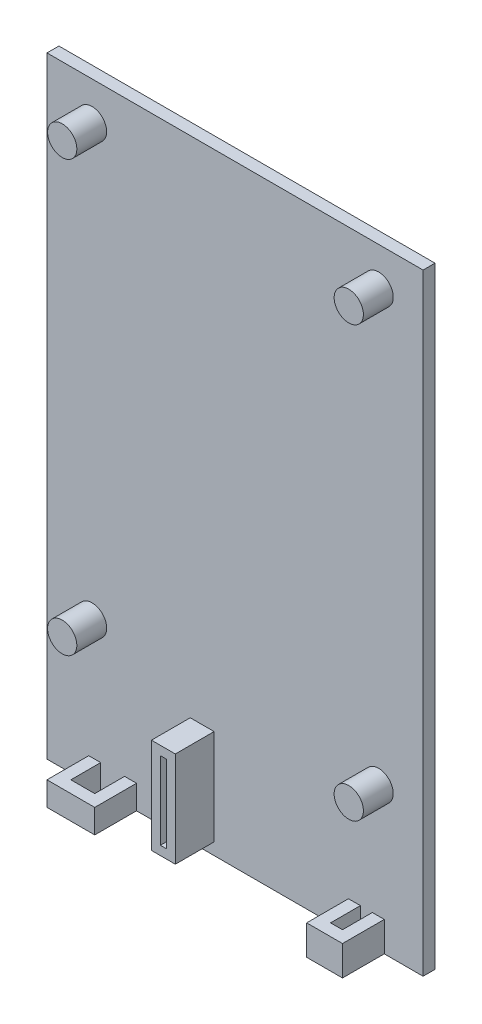
ISO-10303-21;
HEADER;
FILE_DESCRIPTION(('STEP AP214'),'2;1');
FILE_NAME('part.step','',(''),(''),'','','');
FILE_SCHEMA(('AUTOMOTIVE_DESIGN { 1 0 10303 214 1 1 1 1 }'));
ENDSEC;
DATA;
#1=APPLICATION_CONTEXT('core data for automotive mechanical design processes');
#2=APPLICATION_PROTOCOL_DEFINITION('international standard','automotive_design',2000,#1);
#3=PRODUCT_CONTEXT('',#1,'mechanical');
#4=PRODUCT('Part','Part','',(#3));
#5=PRODUCT_RELATED_PRODUCT_CATEGORY('part','',(#4));
#6=PRODUCT_DEFINITION_FORMATION('','',#4);
#7=PRODUCT_DEFINITION_CONTEXT('part definition',#1,'design');
#8=PRODUCT_DEFINITION('design','',#6,#7);
#9=PRODUCT_DEFINITION_SHAPE('','',#8);
#10=(LENGTH_UNIT() NAMED_UNIT(*) SI_UNIT(.MILLI.,.METRE.));
#11=(NAMED_UNIT(*) PLANE_ANGLE_UNIT() SI_UNIT($,.RADIAN.));
#12=(NAMED_UNIT(*) SI_UNIT($,.STERADIAN.) SOLID_ANGLE_UNIT());
#13=UNCERTAINTY_MEASURE_WITH_UNIT(LENGTH_MEASURE(1.E-05),#10,'distance_accuracy_value','');
#14=(GEOMETRIC_REPRESENTATION_CONTEXT(3) GLOBAL_UNCERTAINTY_ASSIGNED_CONTEXT((#13)) GLOBAL_UNIT_ASSIGNED_CONTEXT((#10,
#11,#12)) REPRESENTATION_CONTEXT('',''));
#15=CARTESIAN_POINT('',(0.,0.,0.));
#16=DIRECTION('',(0.,0.,1.));
#17=DIRECTION('',(1.,0.,0.));
#18=AXIS2_PLACEMENT_3D('',#15,#16,#17);
#19=CARTESIAN_POINT('',(0.,0.,2.));
#20=DIRECTION('',(0.,0.,1.));
#21=DIRECTION('',(1.,0.,0.));
#22=AXIS2_PLACEMENT_3D('',#19,#20,#21);
#23=PLANE('',#22);
#24=CARTESIAN_POINT('',(7.55000000000003,-6.45,2.));
#25=DIRECTION('',(0.,0.,1.));
#26=DIRECTION('',(1.,0.,0.));
#27=AXIS2_PLACEMENT_3D('',#24,#25,#26);
#28=CIRCLE('',#27,2.45);
#29=CARTESIAN_POINT('',(10.,-6.45,2.));
#30=VERTEX_POINT('',#29);
#31=EDGE_CURVE('E421',#30,#30,#28,.T.);
#32=ORIENTED_EDGE('',*,*,#31,.F.);
#33=EDGE_LOOP('',(#32));
#34=FACE_BOUND('',#33,.T.);
#35=CARTESIAN_POINT('',(7.55000000000003,-78.45,2.));
#36=DIRECTION('',(0.,0.,1.));
#37=DIRECTION('',(1.,0.,0.));
#38=AXIS2_PLACEMENT_3D('',#35,#36,#37);
#39=CIRCLE('',#38,2.44999999999999);
#40=CARTESIAN_POINT('',(10.,-78.45,2.));
#41=VERTEX_POINT('',#40);
#42=EDGE_CURVE('E415',#41,#41,#39,.T.);
#43=ORIENTED_EDGE('',*,*,#42,.F.);
#44=EDGE_LOOP('',(#43));
#45=FACE_BOUND('',#44,.T.);
#46=CARTESIAN_POINT('',(55.55,-78.45,2.));
#47=DIRECTION('',(0.,0.,1.));
#48=DIRECTION('',(1.,0.,0.));
#49=AXIS2_PLACEMENT_3D('',#46,#47,#48);
#50=CIRCLE('',#49,2.44999999999998);
#51=CARTESIAN_POINT('',(58.,-78.45,2.));
#52=VERTEX_POINT('',#51);
#53=EDGE_CURVE('E409',#52,#52,#50,.T.);
#54=ORIENTED_EDGE('',*,*,#53,.F.);
#55=EDGE_LOOP('',(#54));
#56=FACE_BOUND('',#55,.T.);
#57=CARTESIAN_POINT('',(55.55,-6.45,2.));
#58=DIRECTION('',(0.,0.,1.));
#59=DIRECTION('',(1.,0.,0.));
#60=AXIS2_PLACEMENT_3D('',#57,#58,#59);
#61=CIRCLE('',#60,2.45);
#62=CARTESIAN_POINT('',(58.,-6.45,2.));
#63=VERTEX_POINT('',#62);
#64=EDGE_CURVE('E405',#63,#63,#61,.T.);
#65=ORIENTED_EDGE('',*,*,#64,.F.);
#66=EDGE_LOOP('',(#65));
#67=FACE_BOUND('',#66,.T.);
#68=DIRECTION('',(-1.,0.,0.));
#69=VECTOR('',#68,1.);
#70=CARTESIAN_POINT('',(7.,-98.45,2.));
#71=LINE('',#70,#69);
#72=CARTESIAN_POINT('',(9.,-98.45,2.));
#73=VERTEX_POINT('',#72);
#74=CARTESIAN_POINT('',(7.,-98.45,2.));
#75=VERTEX_POINT('',#74);
#76=EDGE_CURVE('E382',#73,#75,#71,.T.);
#77=ORIENTED_EDGE('',*,*,#76,.F.);
#78=DIRECTION('',(0.,-1.,0.));
#79=VECTOR('',#78,1.);
#80=CARTESIAN_POINT('',(9.,-97.45,2.));
#81=LINE('',#80,#79);
#82=CARTESIAN_POINT('',(9.,-102.45,2.));
#83=VERTEX_POINT('',#82);
#84=EDGE_CURVE('E298',#73,#83,#81,.T.);
#85=ORIENTED_EDGE('',*,*,#84,.T.);
#86=DIRECTION('',(1.,0.,0.));
#87=VECTOR('',#86,1.);
#88=CARTESIAN_POINT('',(9.,-102.45,2.));
#89=LINE('',#88,#87);
#90=CARTESIAN_POINT('',(13.,-102.45,2.));
#91=VERTEX_POINT('',#90);
#92=EDGE_CURVE('E288',#83,#91,#89,.T.);
#93=ORIENTED_EDGE('',*,*,#92,.T.);
#94=DIRECTION('',(0.,-1.,0.));
#95=VECTOR('',#94,1.);
#96=CARTESIAN_POINT('',(13.,-97.45,2.));
#97=LINE('',#96,#95);
#98=CARTESIAN_POINT('',(13.,-98.45,2.));
#99=VERTEX_POINT('',#98);
#100=EDGE_CURVE('E304',#99,#91,#97,.T.);
#101=ORIENTED_EDGE('',*,*,#100,.F.);
#102=CARTESIAN_POINT('',(15.,-98.45,2.));
#103=VERTEX_POINT('',#102);
#104=EDGE_CURVE('E370',#103,#99,#71,.T.);
#105=ORIENTED_EDGE('',*,*,#104,.F.);
#106=DIRECTION('',(0.,1.,0.));
#107=VECTOR('',#106,1.);
#108=CARTESIAN_POINT('',(15.,-102.45,2.));
#109=LINE('',#108,#107);
#110=CARTESIAN_POINT('',(15.,-102.45,2.));
#111=VERTEX_POINT('',#110);
#112=EDGE_CURVE('E379',#111,#103,#109,.T.);
#113=ORIENTED_EDGE('',*,*,#112,.F.);
#114=DIRECTION('',(1.,0.,0.));
#115=VECTOR('',#114,1.);
#116=CARTESIAN_POINT('',(0.,-102.45,2.));
#117=LINE('',#116,#115);
#118=CARTESIAN_POINT('',(50.5,-102.45,2.));
#119=VERTEX_POINT('',#118);
#120=EDGE_CURVE('E400',#111,#119,#117,.T.);
#121=ORIENTED_EDGE('',*,*,#120,.T.);
#122=DIRECTION('',(0.,-1.,0.));
#123=VECTOR('',#122,1.);
#124=CARTESIAN_POINT('',(50.5,-102.45,2.));
#125=LINE('',#124,#123);
#126=CARTESIAN_POINT('',(50.5,-97.45,2.));
#127=VERTEX_POINT('',#126);
#128=EDGE_CURVE('E301',#127,#119,#125,.T.);
#129=ORIENTED_EDGE('',*,*,#128,.F.);
#130=DIRECTION('',(-1.,0.,0.));
#131=VECTOR('',#130,1.);
#132=CARTESIAN_POINT('',(50.5,-97.45,2.));
#133=LINE('',#132,#131);
#134=CARTESIAN_POINT('',(52.5,-97.45,2.));
#135=VERTEX_POINT('',#134);
#136=EDGE_CURVE('E351',#135,#127,#133,.T.);
#137=ORIENTED_EDGE('',*,*,#136,.F.);
#138=DIRECTION('',(0.,-1.,0.));
#139=VECTOR('',#138,1.);
#140=CARTESIAN_POINT('',(52.5,-97.45,2.));
#141=LINE('',#140,#139);
#142=CARTESIAN_POINT('',(52.5,-102.45,2.));
#143=VERTEX_POINT('',#142);
#144=EDGE_CURVE('E318',#135,#143,#141,.T.);
#145=ORIENTED_EDGE('',*,*,#144,.T.);
#146=DIRECTION('',(1.,0.,0.));
#147=VECTOR('',#146,1.);
#148=CARTESIAN_POINT('',(52.5,-102.45,2.));
#149=LINE('',#148,#147);
#150=CARTESIAN_POINT('',(54.5,-102.45,2.));
#151=VERTEX_POINT('',#150);
#152=EDGE_CURVE('E320',#143,#151,#149,.T.);
#153=ORIENTED_EDGE('',*,*,#152,.T.);
#154=DIRECTION('',(0.,-1.,0.));
#155=VECTOR('',#154,1.);
#156=CARTESIAN_POINT('',(54.5,-97.45,2.));
#157=LINE('',#156,#155);
#158=CARTESIAN_POINT('',(54.5,-97.45,2.));
#159=VERTEX_POINT('',#158);
#160=EDGE_CURVE('E331',#159,#151,#157,.T.);
#161=ORIENTED_EDGE('',*,*,#160,.F.);
#162=CARTESIAN_POINT('',(56.5,-97.45,2.));
#163=VERTEX_POINT('',#162);
#164=EDGE_CURVE('E339',#163,#159,#133,.T.);
#165=ORIENTED_EDGE('',*,*,#164,.F.);
#166=DIRECTION('',(0.,1.,0.));
#167=VECTOR('',#166,1.);
#168=CARTESIAN_POINT('',(56.5,-102.45,2.));
#169=LINE('',#168,#167);
#170=CARTESIAN_POINT('',(56.5,-102.45,2.));
#171=VERTEX_POINT('',#170);
#172=EDGE_CURVE('E348',#171,#163,#169,.T.);
#173=ORIENTED_EDGE('',*,*,#172,.F.);
#174=CARTESIAN_POINT('',(63.,-102.45,2.));
#175=VERTEX_POINT('',#174);
#176=EDGE_CURVE('E395',#171,#175,#117,.T.);
#177=ORIENTED_EDGE('',*,*,#176,.T.);
#178=DIRECTION('',(0.,-1.,0.));
#179=VECTOR('',#178,1.);
#180=CARTESIAN_POINT('',(63.,-54.,2.));
#181=LINE('',#180,#179);
#182=CARTESIAN_POINT('',(63.,0.,2.));
#183=VERTEX_POINT('',#182);
#184=EDGE_CURVE('E402',#183,#175,#181,.T.);
#185=ORIENTED_EDGE('',*,*,#184,.F.);
#186=DIRECTION('',(-1.,0.,0.));
#187=VECTOR('',#186,1.);
#188=CARTESIAN_POINT('',(63.,0.,2.));
#189=LINE('',#188,#187);
#190=CARTESIAN_POINT('',(0.,0.,2.));
#191=VERTEX_POINT('',#190);
#192=EDGE_CURVE('E399',#183,#191,#189,.T.);
#193=ORIENTED_EDGE('',*,*,#192,.T.);
#194=DIRECTION('',(0.,-1.,0.));
#195=VECTOR('',#194,1.);
#196=CARTESIAN_POINT('',(0.,0.,2.));
#197=LINE('',#196,#195);
#198=CARTESIAN_POINT('',(0.,-102.45,2.));
#199=VERTEX_POINT('',#198);
#200=EDGE_CURVE('E393',#191,#199,#197,.T.);
#201=ORIENTED_EDGE('',*,*,#200,.T.);
#202=CARTESIAN_POINT('',(7.,-102.45,2.));
#203=VERTEX_POINT('',#202);
#204=EDGE_CURVE('E396',#199,#203,#117,.T.);
#205=ORIENTED_EDGE('',*,*,#204,.T.);
#206=DIRECTION('',(0.,-1.,0.));
#207=VECTOR('',#206,1.);
#208=CARTESIAN_POINT('',(7.,-102.45,2.));
#209=LINE('',#208,#207);
#210=EDGE_CURVE('E365',#75,#203,#209,.T.);
#211=ORIENTED_EDGE('',*,*,#210,.F.);
#212=EDGE_LOOP('',(#77,#85,#93,#101,#105,#113,#121,#129,#137,#145,#153,#161,#165,#173,#177,#185,
#193,#201,#205,#211));
#213=FACE_BOUND('',#212,.T.);
#214=DIRECTION('',(1.,0.,0.));
#215=VECTOR('',#214,1.);
#216=CARTESIAN_POINT('',(24.,-100.45,2.));
#217=LINE('',#216,#215);
#218=CARTESIAN_POINT('',(24.,-100.45,2.));
#219=VERTEX_POINT('',#218);
#220=CARTESIAN_POINT('',(28.,-100.45,2.));
#221=VERTEX_POINT('',#220);
#222=EDGE_CURVE('E272',#219,#221,#217,.T.);
#223=ORIENTED_EDGE('',*,*,#222,.F.);
#224=DIRECTION('',(0.,-1.,0.));
#225=VECTOR('',#224,1.);
#226=CARTESIAN_POINT('',(24.,-84.45,2.));
#227=LINE('',#226,#225);
#228=CARTESIAN_POINT('',(24.,-84.45,2.));
#229=VERTEX_POINT('',#228);
#230=EDGE_CURVE('E237',#229,#219,#227,.T.);
#231=ORIENTED_EDGE('',*,*,#230,.F.);
#232=DIRECTION('',(-1.,0.,0.));
#233=VECTOR('',#232,1.);
#234=CARTESIAN_POINT('',(24.,-84.45,2.));
#235=LINE('',#234,#233);
#236=CARTESIAN_POINT('',(28.,-84.45,2.));
#237=VERTEX_POINT('',#236);
#238=EDGE_CURVE('E263',#237,#229,#235,.T.);
#239=ORIENTED_EDGE('',*,*,#238,.F.);
#240=DIRECTION('',(0.,1.,0.));
#241=VECTOR('',#240,1.);
#242=CARTESIAN_POINT('',(28.,-84.45,2.));
#243=LINE('',#242,#241);
#244=EDGE_CURVE('E274',#221,#237,#243,.T.);
#245=ORIENTED_EDGE('',*,*,#244,.F.);
#246=EDGE_LOOP('',(#223,#231,#239,#245));
#247=FACE_BOUND('',#246,.T.);
#248=ADVANCED_FACE('F33',(#34,#45,#56,#67,#213,#247),#23,.T.);
#249=CARTESIAN_POINT('',(0.,0.,2.));
#250=DIRECTION('',(1.,0.,0.));
#251=DIRECTION('',(0.,1.,0.));
#252=AXIS2_PLACEMENT_3D('',#249,#250,#251);
#253=PLANE('',#252);
#254=ORIENTED_EDGE('',*,*,#200,.F.);
#255=DIRECTION('',(0.,0.,-1.));
#256=VECTOR('',#255,1.);
#257=CARTESIAN_POINT('',(0.,0.,2.));
#258=LINE('',#257,#256);
#259=CARTESIAN_POINT('',(0.,0.,0.));
#260=VERTEX_POINT('',#259);
#261=EDGE_CURVE('E441',#191,#260,#258,.T.);
#262=ORIENTED_EDGE('',*,*,#261,.T.);
#263=DIRECTION('',(0.,-1.,0.));
#264=VECTOR('',#263,1.);
#265=CARTESIAN_POINT('',(0.,0.,0.));
#266=LINE('',#265,#264);
#267=CARTESIAN_POINT('',(0.,-102.45,0.));
#268=VERTEX_POINT('',#267);
#269=EDGE_CURVE('E427',#260,#268,#266,.T.);
#270=ORIENTED_EDGE('',*,*,#269,.T.);
#271=DIRECTION('',(0.,0.,-1.));
#272=VECTOR('',#271,1.);
#273=CARTESIAN_POINT('',(0.,-102.45,2.));
#274=LINE('',#273,#272);
#275=EDGE_CURVE('E447',#199,#268,#274,.T.);
#276=ORIENTED_EDGE('',*,*,#275,.F.);
#277=EDGE_LOOP('',(#254,#262,#270,#276));
#278=FACE_BOUND('',#277,.T.);
#279=ADVANCED_FACE('F35',(#278),#253,.F.);
#280=CARTESIAN_POINT('',(50.,-102.45,2.));
#281=DIRECTION('',(0.,1.,0.));
#282=DIRECTION('',(0.,0.,1.));
#283=AXIS2_PLACEMENT_3D('',#280,#281,#282);
#284=PLANE('',#283);
#285=ORIENTED_EDGE('',*,*,#92,.F.);
#286=DIRECTION('',(0.,0.,-1.));
#287=VECTOR('',#286,1.);
#288=CARTESIAN_POINT('',(9.,-102.45,7.));
#289=LINE('',#288,#287);
#290=CARTESIAN_POINT('',(9.,-102.45,7.));
#291=VERTEX_POINT('',#290);
#292=EDGE_CURVE('E286',#291,#83,#289,.T.);
#293=ORIENTED_EDGE('',*,*,#292,.F.);
#294=DIRECTION('',(-1.,0.,0.));
#295=VECTOR('',#294,1.);
#296=CARTESIAN_POINT('',(9.,-102.45,7.));
#297=LINE('',#296,#295);
#298=CARTESIAN_POINT('',(13.,-102.45,7.));
#299=VERTEX_POINT('',#298);
#300=EDGE_CURVE('E295',#299,#291,#297,.T.);
#301=ORIENTED_EDGE('',*,*,#300,.F.);
#302=DIRECTION('',(0.,0.,1.));
#303=VECTOR('',#302,1.);
#304=CARTESIAN_POINT('',(13.,-102.45,7.));
#305=LINE('',#304,#303);
#306=EDGE_CURVE('E292',#91,#299,#305,.T.);
#307=ORIENTED_EDGE('',*,*,#306,.F.);
#308=EDGE_LOOP('',(#285,#293,#301,#307));
#309=FACE_BOUND('',#308,.T.);
#310=ORIENTED_EDGE('',*,*,#152,.F.);
#311=DIRECTION('',(0.,0.,-1.));
#312=VECTOR('',#311,1.);
#313=CARTESIAN_POINT('',(52.5,-102.45,7.));
#314=LINE('',#313,#312);
#315=CARTESIAN_POINT('',(52.5,-102.45,7.));
#316=VERTEX_POINT('',#315);
#317=EDGE_CURVE('E285',#316,#143,#314,.T.);
#318=ORIENTED_EDGE('',*,*,#317,.F.);
#319=DIRECTION('',(-1.,0.,0.));
#320=VECTOR('',#319,1.);
#321=CARTESIAN_POINT('',(52.5,-102.45,7.));
#322=LINE('',#321,#320);
#323=CARTESIAN_POINT('',(54.5,-102.45,7.));
#324=VERTEX_POINT('',#323);
#325=EDGE_CURVE('E312',#324,#316,#322,.T.);
#326=ORIENTED_EDGE('',*,*,#325,.F.);
#327=DIRECTION('',(0.,0.,1.));
#328=VECTOR('',#327,1.);
#329=CARTESIAN_POINT('',(54.5,-102.45,7.));
#330=LINE('',#329,#328);
#331=EDGE_CURVE('E323',#151,#324,#330,.T.);
#332=ORIENTED_EDGE('',*,*,#331,.F.);
#333=EDGE_LOOP('',(#310,#318,#326,#332));
#334=FACE_BOUND('',#333,.T.);
#335=ORIENTED_EDGE('',*,*,#204,.F.);
#336=ORIENTED_EDGE('',*,*,#275,.T.);
#337=DIRECTION('',(1.,0.,0.));
#338=VECTOR('',#337,1.);
#339=CARTESIAN_POINT('',(50.,-102.45,0.));
#340=LINE('',#339,#338);
#341=CARTESIAN_POINT('',(63.,-102.45,0.));
#342=VERTEX_POINT('',#341);
#343=EDGE_CURVE('E432',#268,#342,#340,.T.);
#344=ORIENTED_EDGE('',*,*,#343,.T.);
#345=DIRECTION('',(0.,0.,-1.));
#346=VECTOR('',#345,1.);
#347=CARTESIAN_POINT('',(63.,-102.45,2.));
#348=LINE('',#347,#346);
#349=EDGE_CURVE('E445',#175,#342,#348,.T.);
#350=ORIENTED_EDGE('',*,*,#349,.F.);
#351=ORIENTED_EDGE('',*,*,#176,.F.);
#352=DIRECTION('',(0.,0.,-1.));
#353=VECTOR('',#352,1.);
#354=CARTESIAN_POINT('',(56.5,-102.45,9.));
#355=LINE('',#354,#353);
#356=CARTESIAN_POINT('',(56.5,-102.45,9.));
#357=VERTEX_POINT('',#356);
#358=EDGE_CURVE('E359',#357,#171,#355,.T.);
#359=ORIENTED_EDGE('',*,*,#358,.F.);
#360=DIRECTION('',(1.,0.,0.));
#361=VECTOR('',#360,1.);
#362=CARTESIAN_POINT('',(50.5,-102.45,9.));
#363=LINE('',#362,#361);
#364=CARTESIAN_POINT('',(50.5,-102.45,9.));
#365=VERTEX_POINT('',#364);
#366=EDGE_CURVE('E338',#365,#357,#363,.T.);
#367=ORIENTED_EDGE('',*,*,#366,.F.);
#368=DIRECTION('',(0.,0.,-1.));
#369=VECTOR('',#368,1.);
#370=CARTESIAN_POINT('',(50.5,-102.45,9.));
#371=LINE('',#370,#369);
#372=EDGE_CURVE('E362',#365,#119,#371,.T.);
#373=ORIENTED_EDGE('',*,*,#372,.T.);
#374=ORIENTED_EDGE('',*,*,#120,.F.);
#375=DIRECTION('',(0.,0.,-1.));
#376=VECTOR('',#375,1.);
#377=CARTESIAN_POINT('',(15.,-102.45,9.));
#378=LINE('',#377,#376);
#379=CARTESIAN_POINT('',(15.,-102.45,9.));
#380=VERTEX_POINT('',#379);
#381=EDGE_CURVE('E389',#380,#111,#378,.T.);
#382=ORIENTED_EDGE('',*,*,#381,.F.);
#383=DIRECTION('',(1.,0.,0.));
#384=VECTOR('',#383,1.);
#385=CARTESIAN_POINT('',(7.,-102.45,9.));
#386=LINE('',#385,#384);
#387=CARTESIAN_POINT('',(7.,-102.45,9.));
#388=VERTEX_POINT('',#387);
#389=EDGE_CURVE('E369',#388,#380,#386,.T.);
#390=ORIENTED_EDGE('',*,*,#389,.F.);
#391=DIRECTION('',(0.,0.,-1.));
#392=VECTOR('',#391,1.);
#393=CARTESIAN_POINT('',(7.,-102.45,9.));
#394=LINE('',#393,#392);
#395=EDGE_CURVE('E391',#388,#203,#394,.T.);
#396=ORIENTED_EDGE('',*,*,#395,.T.);
#397=EDGE_LOOP('',(#335,#336,#344,#350,#351,#359,#367,#373,#374,#382,#390,#396));
#398=FACE_BOUND('',#397,.T.);
#399=ADVANCED_FACE('F467',(#309,#334,#398),#284,.F.);
#400=CARTESIAN_POINT('',(63.,0.,2.));
#401=DIRECTION('',(-1.,0.,0.));
#402=DIRECTION('',(0.,-1.,0.));
#403=AXIS2_PLACEMENT_3D('',#400,#401,#402);
#404=PLANE('',#403);
#405=ORIENTED_EDGE('',*,*,#184,.T.);
#406=ORIENTED_EDGE('',*,*,#349,.T.);
#407=DIRECTION('',(0.,1.,0.));
#408=VECTOR('',#407,1.);
#409=CARTESIAN_POINT('',(63.,0.,0.));
#410=LINE('',#409,#408);
#411=CARTESIAN_POINT('',(63.,0.,0.));
#412=VERTEX_POINT('',#411);
#413=EDGE_CURVE('E435',#342,#412,#410,.T.);
#414=ORIENTED_EDGE('',*,*,#413,.T.);
#415=DIRECTION('',(0.,0.,-1.));
#416=VECTOR('',#415,1.);
#417=CARTESIAN_POINT('',(63.,0.,2.));
#418=LINE('',#417,#416);
#419=EDGE_CURVE('E443',#183,#412,#418,.T.);
#420=ORIENTED_EDGE('',*,*,#419,.F.);
#421=EDGE_LOOP('',(#405,#406,#414,#420));
#422=FACE_BOUND('',#421,.T.);
#423=ADVANCED_FACE('F500',(#422),#404,.F.);
#424=CARTESIAN_POINT('',(0.,0.,2.));
#425=DIRECTION('',(0.,-1.,0.));
#426=DIRECTION('',(0.,0.,-1.));
#427=AXIS2_PLACEMENT_3D('',#424,#425,#426);
#428=PLANE('',#427);
#429=ORIENTED_EDGE('',*,*,#192,.F.);
#430=ORIENTED_EDGE('',*,*,#419,.T.);
#431=DIRECTION('',(-1.,0.,0.));
#432=VECTOR('',#431,1.);
#433=CARTESIAN_POINT('',(0.,0.,0.));
#434=LINE('',#433,#432);
#435=EDGE_CURVE('E438',#412,#260,#434,.T.);
#436=ORIENTED_EDGE('',*,*,#435,.T.);
#437=ORIENTED_EDGE('',*,*,#261,.F.);
#438=EDGE_LOOP('',(#429,#430,#436,#437));
#439=FACE_BOUND('',#438,.T.);
#440=ADVANCED_FACE('F510',(#439),#428,.F.);
#441=CARTESIAN_POINT('',(0.,0.,0.));
#442=DIRECTION('',(0.,0.,1.));
#443=DIRECTION('',(1.,0.,0.));
#444=AXIS2_PLACEMENT_3D('',#441,#442,#443);
#445=PLANE('',#444);
#446=ORIENTED_EDGE('',*,*,#343,.F.);
#447=ORIENTED_EDGE('',*,*,#269,.F.);
#448=ORIENTED_EDGE('',*,*,#435,.F.);
#449=ORIENTED_EDGE('',*,*,#413,.F.);
#450=EDGE_LOOP('',(#446,#447,#448,#449));
#451=FACE_BOUND('',#450,.T.);
#452=ADVANCED_FACE('F507',(#451),#445,.F.);
#453=CARTESIAN_POINT('',(7.55000000000003,-6.45,7.));
#454=DIRECTION('',(0.,0.,-1.));
#455=DIRECTION('',(-1.,0.,0.));
#456=AXIS2_PLACEMENT_3D('',#453,#454,#455);
#457=CYLINDRICAL_SURFACE('',#456,2.45);
#458=CARTESIAN_POINT('',(7.55000000000003,-6.45,7.));
#459=DIRECTION('',(0.,0.,1.));
#460=DIRECTION('',(1.,0.,0.));
#461=AXIS2_PLACEMENT_3D('',#458,#459,#460);
#462=CIRCLE('',#461,2.45);
#463=CARTESIAN_POINT('',(10.,-6.45,7.));
#464=VERTEX_POINT('',#463);
#465=EDGE_CURVE('E424',#464,#464,#462,.T.);
#466=ORIENTED_EDGE('',*,*,#465,.F.);
#467=EDGE_LOOP('',(#466));
#468=FACE_BOUND('',#467,.T.);
#469=ORIENTED_EDGE('',*,*,#31,.T.);
#470=EDGE_LOOP('',(#469));
#471=FACE_BOUND('',#470,.T.);
#472=ADVANCED_FACE('F632',(#468,#471),#457,.T.);
#473=CARTESIAN_POINT('',(7.55000000000003,-6.45,7.));
#474=DIRECTION('',(0.,0.,1.));
#475=DIRECTION('',(1.,0.,0.));
#476=AXIS2_PLACEMENT_3D('',#473,#474,#475);
#477=PLANE('',#476);
#478=ORIENTED_EDGE('',*,*,#465,.T.);
#479=EDGE_LOOP('',(#478));
#480=FACE_BOUND('',#479,.T.);
#481=ADVANCED_FACE('F629',(#480),#477,.T.);
#482=CARTESIAN_POINT('',(7.55000000000003,-78.45,7.));
#483=DIRECTION('',(0.,0.,-1.));
#484=DIRECTION('',(-1.,0.,0.));
#485=AXIS2_PLACEMENT_3D('',#482,#483,#484);
#486=CYLINDRICAL_SURFACE('',#485,2.44999999999999);
#487=CARTESIAN_POINT('',(7.55000000000003,-78.45,7.));
#488=DIRECTION('',(0.,0.,1.));
#489=DIRECTION('',(1.,0.,0.));
#490=AXIS2_PLACEMENT_3D('',#487,#488,#489);
#491=CIRCLE('',#490,2.44999999999999);
#492=CARTESIAN_POINT('',(10.,-78.45,7.));
#493=VERTEX_POINT('',#492);
#494=EDGE_CURVE('E418',#493,#493,#491,.T.);
#495=ORIENTED_EDGE('',*,*,#494,.F.);
#496=EDGE_LOOP('',(#495));
#497=FACE_BOUND('',#496,.T.);
#498=ORIENTED_EDGE('',*,*,#42,.T.);
#499=EDGE_LOOP('',(#498));
#500=FACE_BOUND('',#499,.T.);
#501=ADVANCED_FACE('F625',(#497,#500),#486,.T.);
#502=CARTESIAN_POINT('',(7.55000000000003,-78.45,7.));
#503=DIRECTION('',(0.,0.,1.));
#504=DIRECTION('',(1.,0.,0.));
#505=AXIS2_PLACEMENT_3D('',#502,#503,#504);
#506=PLANE('',#505);
#507=ORIENTED_EDGE('',*,*,#494,.T.);
#508=EDGE_LOOP('',(#507));
#509=FACE_BOUND('',#508,.T.);
#510=ADVANCED_FACE('F621',(#509),#506,.T.);
#511=CARTESIAN_POINT('',(55.55,-78.45,7.));
#512=DIRECTION('',(0.,0.,-1.));
#513=DIRECTION('',(-1.,0.,0.));
#514=AXIS2_PLACEMENT_3D('',#511,#512,#513);
#515=CYLINDRICAL_SURFACE('',#514,2.44999999999998);
#516=CARTESIAN_POINT('',(55.55,-78.45,7.));
#517=DIRECTION('',(0.,0.,1.));
#518=DIRECTION('',(1.,0.,0.));
#519=AXIS2_PLACEMENT_3D('',#516,#517,#518);
#520=CIRCLE('',#519,2.44999999999998);
#521=CARTESIAN_POINT('',(58.,-78.45,7.));
#522=VERTEX_POINT('',#521);
#523=EDGE_CURVE('E412',#522,#522,#520,.T.);
#524=ORIENTED_EDGE('',*,*,#523,.F.);
#525=EDGE_LOOP('',(#524));
#526=FACE_BOUND('',#525,.T.);
#527=ORIENTED_EDGE('',*,*,#53,.T.);
#528=EDGE_LOOP('',(#527));
#529=FACE_BOUND('',#528,.T.);
#530=ADVANCED_FACE('F617',(#526,#529),#515,.T.);
#531=CARTESIAN_POINT('',(55.55,-78.45,7.));
#532=DIRECTION('',(0.,0.,1.));
#533=DIRECTION('',(1.,0.,0.));
#534=AXIS2_PLACEMENT_3D('',#531,#532,#533);
#535=PLANE('',#534);
#536=ORIENTED_EDGE('',*,*,#523,.T.);
#537=EDGE_LOOP('',(#536));
#538=FACE_BOUND('',#537,.T.);
#539=ADVANCED_FACE('F613',(#538),#535,.T.);
#540=CARTESIAN_POINT('',(55.55,-6.45,7.));
#541=DIRECTION('',(0.,0.,-1.));
#542=DIRECTION('',(-1.,0.,0.));
#543=AXIS2_PLACEMENT_3D('',#540,#541,#542);
#544=CYLINDRICAL_SURFACE('',#543,2.45);
#545=CARTESIAN_POINT('',(55.55,-6.45,7.));
#546=DIRECTION('',(0.,0.,1.));
#547=DIRECTION('',(1.,0.,0.));
#548=AXIS2_PLACEMENT_3D('',#545,#546,#547);
#549=CIRCLE('',#548,2.45);
#550=CARTESIAN_POINT('',(58.,-6.45,7.));
#551=VERTEX_POINT('',#550);
#552=EDGE_CURVE('E406',#551,#551,#549,.T.);
#553=ORIENTED_EDGE('',*,*,#552,.F.);
#554=EDGE_LOOP('',(#553));
#555=FACE_BOUND('',#554,.T.);
#556=ORIENTED_EDGE('',*,*,#64,.T.);
#557=EDGE_LOOP('',(#556));
#558=FACE_BOUND('',#557,.T.);
#559=ADVANCED_FACE('F609',(#555,#558),#544,.T.);
#560=CARTESIAN_POINT('',(55.55,-6.45,7.));
#561=DIRECTION('',(0.,0.,1.));
#562=DIRECTION('',(1.,0.,0.));
#563=AXIS2_PLACEMENT_3D('',#560,#561,#562);
#564=PLANE('',#563);
#565=ORIENTED_EDGE('',*,*,#552,.T.);
#566=EDGE_LOOP('',(#565));
#567=FACE_BOUND('',#566,.T.);
#568=ADVANCED_FACE('F606',(#567),#564,.T.);
#569=CARTESIAN_POINT('',(7.,-102.45,9.));
#570=DIRECTION('',(1.,0.,0.));
#571=DIRECTION('',(0.,0.,-1.));
#572=AXIS2_PLACEMENT_3D('',#569,#570,#571);
#573=PLANE('',#572);
#574=ORIENTED_EDGE('',*,*,#210,.T.);
#575=ORIENTED_EDGE('',*,*,#395,.F.);
#576=DIRECTION('',(0.,-1.,0.));
#577=VECTOR('',#576,1.);
#578=CARTESIAN_POINT('',(7.,-102.45,9.));
#579=LINE('',#578,#577);
#580=CARTESIAN_POINT('',(7.,-98.45,9.));
#581=VERTEX_POINT('',#580);
#582=EDGE_CURVE('E366',#581,#388,#579,.T.);
#583=ORIENTED_EDGE('',*,*,#582,.F.);
#584=DIRECTION('',(0.,0.,-1.));
#585=VECTOR('',#584,1.);
#586=CARTESIAN_POINT('',(7.,-98.45,9.));
#587=LINE('',#586,#585);
#588=EDGE_CURVE('E376',#581,#75,#587,.T.);
#589=ORIENTED_EDGE('',*,*,#588,.T.);
#590=EDGE_LOOP('',(#574,#575,#583,#589));
#591=FACE_BOUND('',#590,.T.);
#592=ADVANCED_FACE('F478',(#591),#573,.F.);
#593=CARTESIAN_POINT('',(15.,-102.45,9.));
#594=DIRECTION('',(-1.,0.,0.));
#595=DIRECTION('',(0.,0.,1.));
#596=AXIS2_PLACEMENT_3D('',#593,#594,#595);
#597=PLANE('',#596);
#598=ORIENTED_EDGE('',*,*,#112,.T.);
#599=DIRECTION('',(0.,0.,-1.));
#600=VECTOR('',#599,1.);
#601=CARTESIAN_POINT('',(15.,-98.45,9.));
#602=LINE('',#601,#600);
#603=CARTESIAN_POINT('',(15.,-98.45,9.));
#604=VERTEX_POINT('',#603);
#605=EDGE_CURVE('E387',#604,#103,#602,.T.);
#606=ORIENTED_EDGE('',*,*,#605,.F.);
#607=DIRECTION('',(0.,1.,0.));
#608=VECTOR('',#607,1.);
#609=CARTESIAN_POINT('',(15.,-102.45,9.));
#610=LINE('',#609,#608);
#611=EDGE_CURVE('E372',#380,#604,#610,.T.);
#612=ORIENTED_EDGE('',*,*,#611,.F.);
#613=ORIENTED_EDGE('',*,*,#381,.T.);
#614=EDGE_LOOP('',(#598,#606,#612,#613));
#615=FACE_BOUND('',#614,.T.);
#616=ADVANCED_FACE('F488',(#615),#597,.F.);
#617=CARTESIAN_POINT('',(7.,-98.45,9.));
#618=DIRECTION('',(0.,-1.,0.));
#619=DIRECTION('',(0.,0.,-1.));
#620=AXIS2_PLACEMENT_3D('',#617,#618,#619);
#621=PLANE('',#620);
#622=DIRECTION('',(-1.,0.,0.));
#623=VECTOR('',#622,1.);
#624=CARTESIAN_POINT('',(7.,-98.45,7.));
#625=LINE('',#624,#623);
#626=CARTESIAN_POINT('',(13.,-98.45,7.));
#627=VERTEX_POINT('',#626);
#628=CARTESIAN_POINT('',(9.,-98.45,7.));
#629=VERTEX_POINT('',#628);
#630=EDGE_CURVE('E41',#627,#629,#625,.T.);
#631=ORIENTED_EDGE('',*,*,#630,.T.);
#632=DIRECTION('',(0.,0.,-1.));
#633=VECTOR('',#632,1.);
#634=CARTESIAN_POINT('',(9.,-98.45,9.));
#635=LINE('',#634,#633);
#636=EDGE_CURVE('E11',#629,#73,#635,.T.);
#637=ORIENTED_EDGE('',*,*,#636,.T.);
#638=ORIENTED_EDGE('',*,*,#76,.T.);
#639=ORIENTED_EDGE('',*,*,#588,.F.);
#640=DIRECTION('',(-1.,0.,0.));
#641=VECTOR('',#640,1.);
#642=CARTESIAN_POINT('',(7.,-98.45,9.));
#643=LINE('',#642,#641);
#644=EDGE_CURVE('E374',#604,#581,#643,.T.);
#645=ORIENTED_EDGE('',*,*,#644,.F.);
#646=ORIENTED_EDGE('',*,*,#605,.T.);
#647=ORIENTED_EDGE('',*,*,#104,.T.);
#648=DIRECTION('',(0.,0.,1.));
#649=VECTOR('',#648,1.);
#650=CARTESIAN_POINT('',(13.,-98.45,9.));
#651=LINE('',#650,#649);
#652=EDGE_CURVE('E449',#99,#627,#651,.T.);
#653=ORIENTED_EDGE('',*,*,#652,.T.);
#654=EDGE_LOOP('',(#631,#637,#638,#639,#645,#646,#647,#653));
#655=FACE_BOUND('',#654,.T.);
#656=ADVANCED_FACE('F453',(#655),#621,.F.);
#657=CARTESIAN_POINT('',(0.,0.,9.));
#658=DIRECTION('',(0.,0.,-1.));
#659=DIRECTION('',(-1.,0.,0.));
#660=AXIS2_PLACEMENT_3D('',#657,#658,#659);
#661=PLANE('',#660);
#662=ORIENTED_EDGE('',*,*,#582,.T.);
#663=ORIENTED_EDGE('',*,*,#389,.T.);
#664=ORIENTED_EDGE('',*,*,#611,.T.);
#665=ORIENTED_EDGE('',*,*,#644,.T.);
#666=EDGE_LOOP('',(#662,#663,#664,#665));
#667=FACE_BOUND('',#666,.T.);
#668=ADVANCED_FACE('F481',(#667),#661,.F.);
#669=CARTESIAN_POINT('',(50.5,-102.45,9.));
#670=DIRECTION('',(1.,0.,0.));
#671=DIRECTION('',(0.,0.,-1.));
#672=AXIS2_PLACEMENT_3D('',#669,#670,#671);
#673=PLANE('',#672);
#674=ORIENTED_EDGE('',*,*,#128,.T.);
#675=ORIENTED_EDGE('',*,*,#372,.F.);
#676=DIRECTION('',(0.,-1.,0.));
#677=VECTOR('',#676,1.);
#678=CARTESIAN_POINT('',(50.5,-102.45,9.));
#679=LINE('',#678,#677);
#680=CARTESIAN_POINT('',(50.5,-97.45,9.));
#681=VERTEX_POINT('',#680);
#682=EDGE_CURVE('E335',#681,#365,#679,.T.);
#683=ORIENTED_EDGE('',*,*,#682,.F.);
#684=DIRECTION('',(0.,0.,-1.));
#685=VECTOR('',#684,1.);
#686=CARTESIAN_POINT('',(50.5,-97.45,9.));
#687=LINE('',#686,#685);
#688=EDGE_CURVE('E345',#681,#127,#687,.T.);
#689=ORIENTED_EDGE('',*,*,#688,.T.);
#690=EDGE_LOOP('',(#674,#675,#683,#689));
#691=FACE_BOUND('',#690,.T.);
#692=ADVANCED_FACE('F593',(#691),#673,.F.);
#693=CARTESIAN_POINT('',(56.5,-102.45,9.));
#694=DIRECTION('',(-1.,0.,0.));
#695=DIRECTION('',(0.,0.,1.));
#696=AXIS2_PLACEMENT_3D('',#693,#694,#695);
#697=PLANE('',#696);
#698=ORIENTED_EDGE('',*,*,#172,.T.);
#699=DIRECTION('',(0.,0.,-1.));
#700=VECTOR('',#699,1.);
#701=CARTESIAN_POINT('',(56.5,-97.45,9.));
#702=LINE('',#701,#700);
#703=CARTESIAN_POINT('',(56.5,-97.45,9.));
#704=VERTEX_POINT('',#703);
#705=EDGE_CURVE('E356',#704,#163,#702,.T.);
#706=ORIENTED_EDGE('',*,*,#705,.F.);
#707=DIRECTION('',(0.,1.,0.));
#708=VECTOR('',#707,1.);
#709=CARTESIAN_POINT('',(56.5,-102.45,9.));
#710=LINE('',#709,#708);
#711=EDGE_CURVE('E341',#357,#704,#710,.T.);
#712=ORIENTED_EDGE('',*,*,#711,.F.);
#713=ORIENTED_EDGE('',*,*,#358,.T.);
#714=EDGE_LOOP('',(#698,#706,#712,#713));
#715=FACE_BOUND('',#714,.T.);
#716=ADVANCED_FACE('F589',(#715),#697,.F.);
#717=CARTESIAN_POINT('',(50.5,-97.45,9.));
#718=DIRECTION('',(0.,-1.,0.));
#719=DIRECTION('',(0.,0.,-1.));
#720=AXIS2_PLACEMENT_3D('',#717,#718,#719);
#721=PLANE('',#720);
#722=DIRECTION('',(-1.,0.,0.));
#723=VECTOR('',#722,1.);
#724=CARTESIAN_POINT('',(52.5,-97.45,7.));
#725=LINE('',#724,#723);
#726=CARTESIAN_POINT('',(54.5,-97.45,7.));
#727=VERTEX_POINT('',#726);
#728=CARTESIAN_POINT('',(52.5,-97.45,7.));
#729=VERTEX_POINT('',#728);
#730=EDGE_CURVE('E315',#727,#729,#725,.T.);
#731=ORIENTED_EDGE('',*,*,#730,.T.);
#732=DIRECTION('',(0.,0.,-1.));
#733=VECTOR('',#732,1.);
#734=CARTESIAN_POINT('',(52.5,-97.45,7.));
#735=LINE('',#734,#733);
#736=EDGE_CURVE('E308',#729,#135,#735,.T.);
#737=ORIENTED_EDGE('',*,*,#736,.T.);
#738=ORIENTED_EDGE('',*,*,#136,.T.);
#739=ORIENTED_EDGE('',*,*,#688,.F.);
#740=DIRECTION('',(-1.,0.,0.));
#741=VECTOR('',#740,1.);
#742=CARTESIAN_POINT('',(50.5,-97.45,9.));
#743=LINE('',#742,#741);
#744=EDGE_CURVE('E343',#704,#681,#743,.T.);
#745=ORIENTED_EDGE('',*,*,#744,.F.);
#746=ORIENTED_EDGE('',*,*,#705,.T.);
#747=ORIENTED_EDGE('',*,*,#164,.T.);
#748=DIRECTION('',(0.,0.,1.));
#749=VECTOR('',#748,1.);
#750=CARTESIAN_POINT('',(54.5,-97.45,7.));
#751=LINE('',#750,#749);
#752=EDGE_CURVE('E311',#159,#727,#751,.T.);
#753=ORIENTED_EDGE('',*,*,#752,.T.);
#754=EDGE_LOOP('',(#731,#737,#738,#739,#745,#746,#747,#753));
#755=FACE_BOUND('',#754,.T.);
#756=ADVANCED_FACE('F585',(#755),#721,.F.);
#757=CARTESIAN_POINT('',(0.,0.,9.));
#758=DIRECTION('',(0.,0.,-1.));
#759=DIRECTION('',(-1.,0.,0.));
#760=AXIS2_PLACEMENT_3D('',#757,#758,#759);
#761=PLANE('',#760);
#762=ORIENTED_EDGE('',*,*,#682,.T.);
#763=ORIENTED_EDGE('',*,*,#366,.T.);
#764=ORIENTED_EDGE('',*,*,#711,.T.);
#765=ORIENTED_EDGE('',*,*,#744,.T.);
#766=EDGE_LOOP('',(#762,#763,#764,#765));
#767=FACE_BOUND('',#766,.T.);
#768=ADVANCED_FACE('F581',(#767),#761,.F.);
#769=CARTESIAN_POINT('',(52.5,-97.45,7.));
#770=DIRECTION('',(-1.,0.,0.));
#771=DIRECTION('',(0.,0.,1.));
#772=AXIS2_PLACEMENT_3D('',#769,#770,#771);
#773=PLANE('',#772);
#774=ORIENTED_EDGE('',*,*,#317,.T.);
#775=ORIENTED_EDGE('',*,*,#144,.F.);
#776=ORIENTED_EDGE('',*,*,#736,.F.);
#777=DIRECTION('',(0.,-1.,0.));
#778=VECTOR('',#777,1.);
#779=CARTESIAN_POINT('',(52.5,-97.45,7.));
#780=LINE('',#779,#778);
#781=EDGE_CURVE('E289',#729,#316,#780,.T.);
#782=ORIENTED_EDGE('',*,*,#781,.T.);
#783=EDGE_LOOP('',(#774,#775,#776,#782));
#784=FACE_BOUND('',#783,.T.);
#785=ADVANCED_FACE('F574',(#784),#773,.F.);
#786=CARTESIAN_POINT('',(52.5,-97.45,7.));
#787=DIRECTION('',(0.,0.,1.));
#788=DIRECTION('',(1.,0.,0.));
#789=AXIS2_PLACEMENT_3D('',#786,#787,#788);
#790=PLANE('',#789);
#791=ORIENTED_EDGE('',*,*,#325,.T.);
#792=ORIENTED_EDGE('',*,*,#781,.F.);
#793=ORIENTED_EDGE('',*,*,#730,.F.);
#794=DIRECTION('',(0.,-1.,0.));
#795=VECTOR('',#794,1.);
#796=CARTESIAN_POINT('',(54.5,-97.45,7.));
#797=LINE('',#796,#795);
#798=EDGE_CURVE('E329',#727,#324,#797,.T.);
#799=ORIENTED_EDGE('',*,*,#798,.T.);
#800=EDGE_LOOP('',(#791,#792,#793,#799));
#801=FACE_BOUND('',#800,.T.);
#802=ADVANCED_FACE('F571',(#801),#790,.F.);
#803=CARTESIAN_POINT('',(54.5,-97.45,7.));
#804=DIRECTION('',(1.,0.,0.));
#805=DIRECTION('',(0.,0.,-1.));
#806=AXIS2_PLACEMENT_3D('',#803,#804,#805);
#807=PLANE('',#806);
#808=ORIENTED_EDGE('',*,*,#331,.T.);
#809=ORIENTED_EDGE('',*,*,#798,.F.);
#810=ORIENTED_EDGE('',*,*,#752,.F.);
#811=ORIENTED_EDGE('',*,*,#160,.T.);
#812=EDGE_LOOP('',(#808,#809,#810,#811));
#813=FACE_BOUND('',#812,.T.);
#814=ADVANCED_FACE('F570',(#813),#807,.F.);
#815=CARTESIAN_POINT('',(9.,-97.45,7.));
#816=DIRECTION('',(-1.,0.,0.));
#817=DIRECTION('',(0.,0.,1.));
#818=AXIS2_PLACEMENT_3D('',#815,#816,#817);
#819=PLANE('',#818);
#820=DIRECTION('',(0.,-1.,0.));
#821=VECTOR('',#820,1.);
#822=CARTESIAN_POINT('',(9.,-97.45,7.));
#823=LINE('',#822,#821);
#824=EDGE_CURVE('E299',#629,#291,#823,.T.);
#825=ORIENTED_EDGE('',*,*,#824,.T.);
#826=ORIENTED_EDGE('',*,*,#292,.T.);
#827=ORIENTED_EDGE('',*,*,#84,.F.);
#828=ORIENTED_EDGE('',*,*,#636,.F.);
#829=EDGE_LOOP('',(#825,#826,#827,#828));
#830=FACE_BOUND('',#829,.T.);
#831=ADVANCED_FACE('F470',(#830),#819,.F.);
#832=CARTESIAN_POINT('',(9.,-97.45,7.));
#833=DIRECTION('',(0.,0.,1.));
#834=DIRECTION('',(1.,0.,0.));
#835=AXIS2_PLACEMENT_3D('',#832,#833,#834);
#836=PLANE('',#835);
#837=DIRECTION('',(0.,-1.,0.));
#838=VECTOR('',#837,1.);
#839=CARTESIAN_POINT('',(13.,-97.45,7.));
#840=LINE('',#839,#838);
#841=EDGE_CURVE('E302',#627,#299,#840,.T.);
#842=ORIENTED_EDGE('',*,*,#841,.T.);
#843=ORIENTED_EDGE('',*,*,#300,.T.);
#844=ORIENTED_EDGE('',*,*,#824,.F.);
#845=ORIENTED_EDGE('',*,*,#630,.F.);
#846=EDGE_LOOP('',(#842,#843,#844,#845));
#847=FACE_BOUND('',#846,.T.);
#848=ADVANCED_FACE('F459',(#847),#836,.F.);
#849=CARTESIAN_POINT('',(13.,-97.45,7.));
#850=DIRECTION('',(1.,0.,0.));
#851=DIRECTION('',(0.,0.,-1.));
#852=AXIS2_PLACEMENT_3D('',#849,#850,#851);
#853=PLANE('',#852);
#854=ORIENTED_EDGE('',*,*,#100,.T.);
#855=ORIENTED_EDGE('',*,*,#306,.T.);
#856=ORIENTED_EDGE('',*,*,#841,.F.);
#857=ORIENTED_EDGE('',*,*,#652,.F.);
#858=EDGE_LOOP('',(#854,#855,#856,#857));
#859=FACE_BOUND('',#858,.T.);
#860=ADVANCED_FACE('F461',(#859),#853,.F.);
#861=CARTESIAN_POINT('',(0.,0.,8.5));
#862=DIRECTION('',(0.,0.,1.));
#863=DIRECTION('',(1.,0.,0.));
#864=AXIS2_PLACEMENT_3D('',#861,#862,#863);
#865=PLANE('',#864);
#866=DIRECTION('',(0.,-1.,0.));
#867=VECTOR('',#866,1.);
#868=CARTESIAN_POINT('',(24.,-84.45,8.5));
#869=LINE('',#868,#867);
#870=CARTESIAN_POINT('',(24.,-84.45,8.5));
#871=VERTEX_POINT('',#870);
#872=CARTESIAN_POINT('',(24.,-100.45,8.5));
#873=VERTEX_POINT('',#872);
#874=EDGE_CURVE('E259',#871,#873,#869,.T.);
#875=ORIENTED_EDGE('',*,*,#874,.T.);
#876=DIRECTION('',(1.,0.,0.));
#877=VECTOR('',#876,1.);
#878=CARTESIAN_POINT('',(24.,-100.45,8.5));
#879=LINE('',#878,#877);
#880=CARTESIAN_POINT('',(28.,-100.45,8.5));
#881=VERTEX_POINT('',#880);
#882=EDGE_CURVE('E262',#873,#881,#879,.T.);
#883=ORIENTED_EDGE('',*,*,#882,.T.);
#884=DIRECTION('',(0.,1.,0.));
#885=VECTOR('',#884,1.);
#886=CARTESIAN_POINT('',(28.,-84.45,8.5));
#887=LINE('',#886,#885);
#888=CARTESIAN_POINT('',(28.,-84.45,8.5));
#889=VERTEX_POINT('',#888);
#890=EDGE_CURVE('E265',#881,#889,#887,.T.);
#891=ORIENTED_EDGE('',*,*,#890,.T.);
#892=DIRECTION('',(-1.,0.,0.));
#893=VECTOR('',#892,1.);
#894=CARTESIAN_POINT('',(24.,-84.45,8.5));
#895=LINE('',#894,#893);
#896=EDGE_CURVE('E267',#889,#871,#895,.T.);
#897=ORIENTED_EDGE('',*,*,#896,.T.);
#898=EDGE_LOOP('',(#875,#883,#891,#897));
#899=FACE_BOUND('',#898,.T.);
#900=DIRECTION('',(1.,0.,0.));
#901=VECTOR('',#900,1.);
#902=CARTESIAN_POINT('',(25.5,-98.95,8.5));
#903=LINE('',#902,#901);
#904=CARTESIAN_POINT('',(25.5,-98.95,8.5));
#905=VERTEX_POINT('',#904);
#906=CARTESIAN_POINT('',(26.5,-98.95,8.5));
#907=VERTEX_POINT('',#906);
#908=EDGE_CURVE('E229',#905,#907,#903,.T.);
#909=ORIENTED_EDGE('',*,*,#908,.F.);
#910=DIRECTION('',(0.,-1.,0.));
#911=VECTOR('',#910,1.);
#912=CARTESIAN_POINT('',(25.5,-85.95,8.5));
#913=LINE('',#912,#911);
#914=CARTESIAN_POINT('',(25.5,-85.95,8.5));
#915=VERTEX_POINT('',#914);
#916=EDGE_CURVE('E220',#915,#905,#913,.T.);
#917=ORIENTED_EDGE('',*,*,#916,.F.);
#918=DIRECTION('',(-1.,0.,0.));
#919=VECTOR('',#918,1.);
#920=CARTESIAN_POINT('',(25.5,-85.95,8.5));
#921=LINE('',#920,#919);
#922=CARTESIAN_POINT('',(26.5,-85.95,8.5));
#923=VERTEX_POINT('',#922);
#924=EDGE_CURVE('E245',#923,#915,#921,.T.);
#925=ORIENTED_EDGE('',*,*,#924,.F.);
#926=DIRECTION('',(0.,1.,0.));
#927=VECTOR('',#926,1.);
#928=CARTESIAN_POINT('',(26.5,-85.95,8.5));
#929=LINE('',#928,#927);
#930=EDGE_CURVE('E243',#907,#923,#929,.T.);
#931=ORIENTED_EDGE('',*,*,#930,.F.);
#932=EDGE_LOOP('',(#909,#917,#925,#931));
#933=FACE_BOUND('',#932,.T.);
#934=ADVANCED_FACE('F241',(#899,#933),#865,.T.);
#935=CARTESIAN_POINT('',(24.,-84.45,8.5));
#936=DIRECTION('',(1.,0.,0.));
#937=DIRECTION('',(0.,1.,0.));
#938=AXIS2_PLACEMENT_3D('',#935,#936,#937);
#939=PLANE('',#938);
#940=ORIENTED_EDGE('',*,*,#230,.T.);
#941=DIRECTION('',(0.,0.,-1.));
#942=VECTOR('',#941,1.);
#943=CARTESIAN_POINT('',(24.,-100.45,8.5));
#944=LINE('',#943,#942);
#945=EDGE_CURVE('E283',#873,#219,#944,.T.);
#946=ORIENTED_EDGE('',*,*,#945,.F.);
#947=ORIENTED_EDGE('',*,*,#874,.F.);
#948=DIRECTION('',(0.,0.,-1.));
#949=VECTOR('',#948,1.);
#950=CARTESIAN_POINT('',(24.,-84.45,8.5));
#951=LINE('',#950,#949);
#952=EDGE_CURVE('E269',#871,#229,#951,.T.);
#953=ORIENTED_EDGE('',*,*,#952,.T.);
#954=EDGE_LOOP('',(#940,#946,#947,#953));
#955=FACE_BOUND('',#954,.T.);
#956=ADVANCED_FACE('F549',(#955),#939,.F.);
#957=CARTESIAN_POINT('',(24.,-100.45,8.5));
#958=DIRECTION('',(0.,1.,0.));
#959=DIRECTION('',(0.,0.,1.));
#960=AXIS2_PLACEMENT_3D('',#957,#958,#959);
#961=PLANE('',#960);
#962=ORIENTED_EDGE('',*,*,#222,.T.);
#963=DIRECTION('',(0.,0.,-1.));
#964=VECTOR('',#963,1.);
#965=CARTESIAN_POINT('',(28.,-100.45,8.5));
#966=LINE('',#965,#964);
#967=EDGE_CURVE('E280',#881,#221,#966,.T.);
#968=ORIENTED_EDGE('',*,*,#967,.F.);
#969=ORIENTED_EDGE('',*,*,#882,.F.);
#970=ORIENTED_EDGE('',*,*,#945,.T.);
#971=EDGE_LOOP('',(#962,#968,#969,#970));
#972=FACE_BOUND('',#971,.T.);
#973=ADVANCED_FACE('F556',(#972),#961,.F.);
#974=CARTESIAN_POINT('',(28.,-84.45,8.5));
#975=DIRECTION('',(-1.,0.,0.));
#976=DIRECTION('',(0.,0.,1.));
#977=AXIS2_PLACEMENT_3D('',#974,#975,#976);
#978=PLANE('',#977);
#979=ORIENTED_EDGE('',*,*,#244,.T.);
#980=DIRECTION('',(0.,0.,-1.));
#981=VECTOR('',#980,1.);
#982=CARTESIAN_POINT('',(28.,-84.45,8.5));
#983=LINE('',#982,#981);
#984=EDGE_CURVE('E48',#889,#237,#983,.T.);
#985=ORIENTED_EDGE('',*,*,#984,.F.);
#986=ORIENTED_EDGE('',*,*,#890,.F.);
#987=ORIENTED_EDGE('',*,*,#967,.T.);
#988=EDGE_LOOP('',(#979,#985,#986,#987));
#989=FACE_BOUND('',#988,.T.);
#990=ADVANCED_FACE('F553',(#989),#978,.F.);
#991=CARTESIAN_POINT('',(24.,-84.45,8.5));
#992=DIRECTION('',(0.,-1.,0.));
#993=DIRECTION('',(0.,0.,-1.));
#994=AXIS2_PLACEMENT_3D('',#991,#992,#993);
#995=PLANE('',#994);
#996=ORIENTED_EDGE('',*,*,#238,.T.);
#997=ORIENTED_EDGE('',*,*,#952,.F.);
#998=ORIENTED_EDGE('',*,*,#896,.F.);
#999=ORIENTED_EDGE('',*,*,#984,.T.);
#1000=EDGE_LOOP('',(#996,#997,#998,#999));
#1001=FACE_BOUND('',#1000,.T.);
#1002=ADVANCED_FACE('F546',(#1001),#995,.F.);
#1003=CARTESIAN_POINT('',(25.5,-85.95,8.5));
#1004=DIRECTION('',(1.,0.,0.));
#1005=DIRECTION('',(0.,1.,0.));
#1006=AXIS2_PLACEMENT_3D('',#1003,#1004,#1005);
#1007=PLANE('',#1006);
#1008=DIRECTION('',(0.,-1.,0.));
#1009=VECTOR('',#1008,1.);
#1010=CARTESIAN_POINT('',(25.5,-85.95,2.));
#1011=LINE('',#1010,#1009);
#1012=CARTESIAN_POINT('',(25.5,-85.95,2.));
#1013=VERTEX_POINT('',#1012);
#1014=CARTESIAN_POINT('',(25.5,-98.95,2.));
#1015=VERTEX_POINT('',#1014);
#1016=EDGE_CURVE('E56',#1013,#1015,#1011,.T.);
#1017=ORIENTED_EDGE('',*,*,#1016,.F.);
#1018=DIRECTION('',(0.,0.,-1.));
#1019=VECTOR('',#1018,1.);
#1020=CARTESIAN_POINT('',(25.5,-85.95,8.5));
#1021=LINE('',#1020,#1019);
#1022=EDGE_CURVE('E225',#915,#1013,#1021,.T.);
#1023=ORIENTED_EDGE('',*,*,#1022,.F.);
#1024=ORIENTED_EDGE('',*,*,#916,.T.);
#1025=DIRECTION('',(0.,0.,-1.));
#1026=VECTOR('',#1025,1.);
#1027=CARTESIAN_POINT('',(25.5,-98.95,8.5));
#1028=LINE('',#1027,#1026);
#1029=EDGE_CURVE('E223',#905,#1015,#1028,.T.);
#1030=ORIENTED_EDGE('',*,*,#1029,.T.);
#1031=EDGE_LOOP('',(#1017,#1023,#1024,#1030));
#1032=FACE_BOUND('',#1031,.T.);
#1033=ADVANCED_FACE('F222',(#1032),#1007,.T.);
#1034=CARTESIAN_POINT('',(25.5,-98.95,8.5));
#1035=DIRECTION('',(0.,1.,0.));
#1036=DIRECTION('',(0.,0.,1.));
#1037=AXIS2_PLACEMENT_3D('',#1034,#1035,#1036);
#1038=PLANE('',#1037);
#1039=DIRECTION('',(1.,0.,0.));
#1040=VECTOR('',#1039,1.);
#1041=CARTESIAN_POINT('',(25.5,-98.95,2.));
#1042=LINE('',#1041,#1040);
#1043=CARTESIAN_POINT('',(26.5,-98.95,2.));
#1044=VERTEX_POINT('',#1043);
#1045=EDGE_CURVE('E236',#1015,#1044,#1042,.T.);
#1046=ORIENTED_EDGE('',*,*,#1045,.F.);
#1047=ORIENTED_EDGE('',*,*,#1029,.F.);
#1048=ORIENTED_EDGE('',*,*,#908,.T.);
#1049=DIRECTION('',(0.,0.,-1.));
#1050=VECTOR('',#1049,1.);
#1051=CARTESIAN_POINT('',(26.5,-98.95,8.5));
#1052=LINE('',#1051,#1050);
#1053=EDGE_CURVE('E238',#907,#1044,#1052,.T.);
#1054=ORIENTED_EDGE('',*,*,#1053,.T.);
#1055=EDGE_LOOP('',(#1046,#1047,#1048,#1054));
#1056=FACE_BOUND('',#1055,.T.);
#1057=ADVANCED_FACE('F233',(#1056),#1038,.T.);
#1058=CARTESIAN_POINT('',(26.5,-85.95,8.5));
#1059=DIRECTION('',(-1.,0.,0.));
#1060=DIRECTION('',(0.,0.,1.));
#1061=AXIS2_PLACEMENT_3D('',#1058,#1059,#1060);
#1062=PLANE('',#1061);
#1063=DIRECTION('',(0.,1.,0.));
#1064=VECTOR('',#1063,1.);
#1065=CARTESIAN_POINT('',(26.5,-85.95,2.));
#1066=LINE('',#1065,#1064);
#1067=CARTESIAN_POINT('',(26.5,-85.95,2.));
#1068=VERTEX_POINT('',#1067);
#1069=EDGE_CURVE('E251',#1044,#1068,#1066,.T.);
#1070=ORIENTED_EDGE('',*,*,#1069,.F.);
#1071=ORIENTED_EDGE('',*,*,#1053,.F.);
#1072=ORIENTED_EDGE('',*,*,#930,.T.);
#1073=DIRECTION('',(0.,0.,-1.));
#1074=VECTOR('',#1073,1.);
#1075=CARTESIAN_POINT('',(26.5,-85.95,8.5));
#1076=LINE('',#1075,#1074);
#1077=EDGE_CURVE('E255',#923,#1068,#1076,.T.);
#1078=ORIENTED_EDGE('',*,*,#1077,.T.);
#1079=EDGE_LOOP('',(#1070,#1071,#1072,#1078));
#1080=FACE_BOUND('',#1079,.T.);
#1081=ADVANCED_FACE('F532',(#1080),#1062,.T.);
#1082=CARTESIAN_POINT('',(25.5,-85.95,8.5));
#1083=DIRECTION('',(0.,-1.,0.));
#1084=DIRECTION('',(0.,0.,-1.));
#1085=AXIS2_PLACEMENT_3D('',#1082,#1083,#1084);
#1086=PLANE('',#1085);
#1087=DIRECTION('',(-1.,0.,0.));
#1088=VECTOR('',#1087,1.);
#1089=CARTESIAN_POINT('',(25.5,-85.95,2.));
#1090=LINE('',#1089,#1088);
#1091=EDGE_CURVE('E230',#1068,#1013,#1090,.T.);
#1092=ORIENTED_EDGE('',*,*,#1091,.F.);
#1093=ORIENTED_EDGE('',*,*,#1077,.F.);
#1094=ORIENTED_EDGE('',*,*,#924,.T.);
#1095=ORIENTED_EDGE('',*,*,#1022,.T.);
#1096=EDGE_LOOP('',(#1092,#1093,#1094,#1095));
#1097=FACE_BOUND('',#1096,.T.);
#1098=ADVANCED_FACE('F528',(#1097),#1086,.T.);
#1099=ORIENTED_EDGE('',*,*,#1016,.T.);
#1100=ORIENTED_EDGE('',*,*,#1045,.T.);
#1101=ORIENTED_EDGE('',*,*,#1069,.T.);
#1102=ORIENTED_EDGE('',*,*,#1091,.T.);
#1103=EDGE_LOOP('',(#1099,#1100,#1101,#1102));
#1104=FACE_BOUND('',#1103,.T.);
#1105=ADVANCED_FACE('F520',(#1104),#23,.T.);
#1106=CLOSED_SHELL('',(#248,#279,#399,#423,#440,#452,#472,#481,#501,#510,#530,#539,#559,#568,
#592,#616,#656,#668,#692,#716,#756,#768,#785,#802,#814,#831,#848,#860,#934,#956,#973,#990,#1002,
#1033,#1057,#1081,#1098,#1105));
#1107=MANIFOLD_SOLID_BREP('B2',#1106);
#1108=ADVANCED_BREP_SHAPE_REPRESENTATION('',(#18,#1107),#14);
#1109=SHAPE_DEFINITION_REPRESENTATION(#9,#1108);
ENDSEC;
END-ISO-10303-21;
